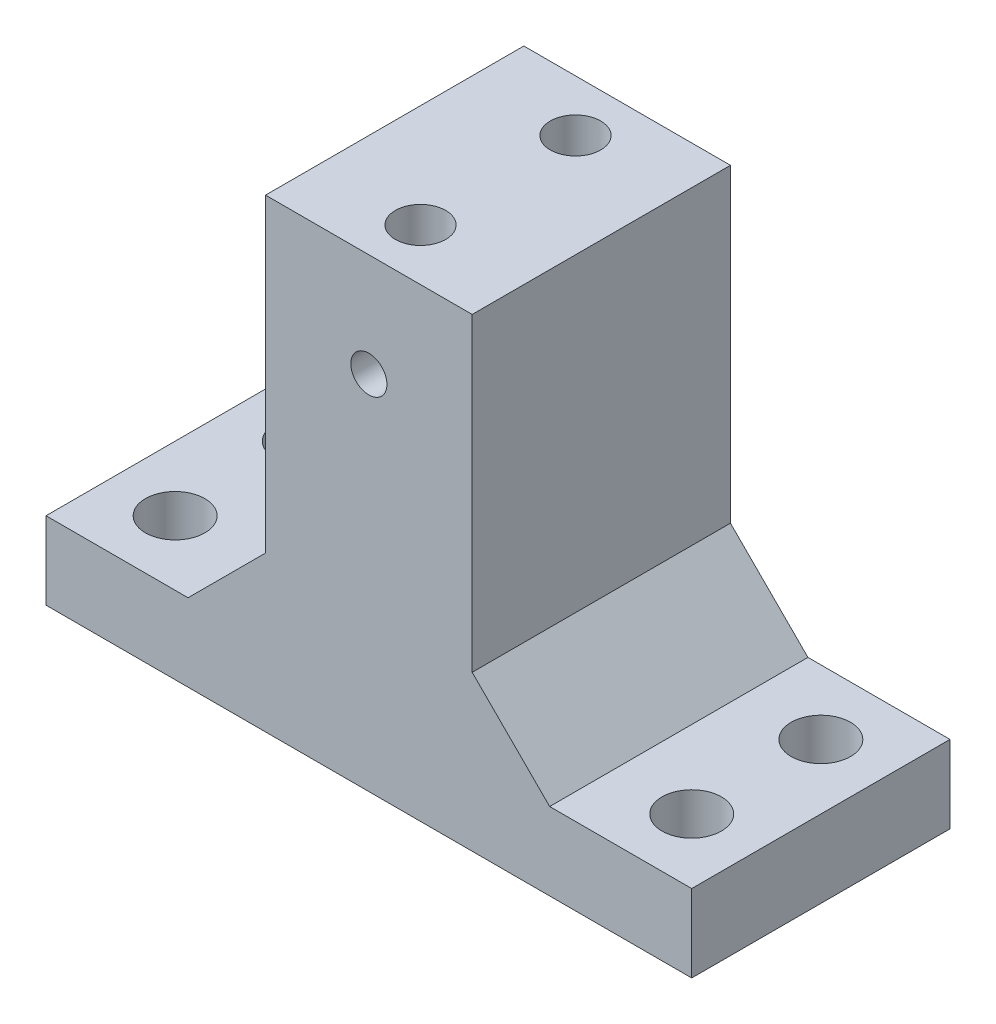
ISO-10303-21;
HEADER;
FILE_DESCRIPTION(('STEP AP214'),'2;1');
FILE_NAME('part.step','',(''),(''),'','','');
FILE_SCHEMA(('AUTOMOTIVE_DESIGN { 1 0 10303 214 1 1 1 1 }'));
ENDSEC;
DATA;
#1=APPLICATION_CONTEXT('core data for automotive mechanical design processes');
#2=APPLICATION_PROTOCOL_DEFINITION('international standard','automotive_design',2000,#1);
#3=PRODUCT_CONTEXT('',#1,'mechanical');
#4=PRODUCT('Part','Part','',(#3));
#5=PRODUCT_RELATED_PRODUCT_CATEGORY('part','',(#4));
#6=PRODUCT_DEFINITION_FORMATION('','',#4);
#7=PRODUCT_DEFINITION_CONTEXT('part definition',#1,'design');
#8=PRODUCT_DEFINITION('design','',#6,#7);
#9=PRODUCT_DEFINITION_SHAPE('','',#8);
#10=(LENGTH_UNIT() NAMED_UNIT(*) SI_UNIT(.MILLI.,.METRE.));
#11=(NAMED_UNIT(*) PLANE_ANGLE_UNIT() SI_UNIT($,.RADIAN.));
#12=(NAMED_UNIT(*) SI_UNIT($,.STERADIAN.) SOLID_ANGLE_UNIT());
#13=UNCERTAINTY_MEASURE_WITH_UNIT(LENGTH_MEASURE(1.E-05),#10,'distance_accuracy_value','');
#14=(GEOMETRIC_REPRESENTATION_CONTEXT(3) GLOBAL_UNCERTAINTY_ASSIGNED_CONTEXT((#13)) GLOBAL_UNIT_ASSIGNED_CONTEXT((#10,
#11,#12)) REPRESENTATION_CONTEXT('',''));
#15=CARTESIAN_POINT('',(0.,0.,0.));
#16=DIRECTION('',(0.,0.,1.));
#17=DIRECTION('',(1.,0.,0.));
#18=AXIS2_PLACEMENT_3D('',#15,#16,#17);
#19=CARTESIAN_POINT('',(0.,14.,24.6977156035922));
#20=DIRECTION('',(0.,0.,-1.));
#21=DIRECTION('',(-1.,0.,0.));
#22=AXIS2_PLACEMENT_3D('',#19,#20,#21);
#23=CYLINDRICAL_SURFACE('',#22,0.7);
#24=DIRECTION('',(0.,0.,-1.));
#25=VECTOR('',#24,1.);
#26=CARTESIAN_POINT('',(0.489897948556636,14.5,24.6977156035922));
#27=LINE('',#26,#25);
#28=CARTESIAN_POINT('',(0.489897948556636,14.5,-3.84298576500437));
#29=VERTEX_POINT('',#28);
#30=CARTESIAN_POINT('',(0.489897948556636,14.5,-2.15701423499563));
#31=VERTEX_POINT('',#30);
#32=EDGE_CURVE('E200',#29,#31,#27,.F.);
#33=ORIENTED_EDGE('',*,*,#32,.F.);
#34=CARTESIAN_POINT('',(0.489897948556636,14.5,-3.84298576500437));
#35=CARTESIAN_POINT('',(0.463702076997501,14.5256665395073,-3.858240649933));
#36=CARTESIAN_POINT('',(0.435290038081003,14.549464935486,-3.8730859267297));
#37=CARTESIAN_POINT('',(0.374178364808877,14.5927964363714,-3.90096614621531));
#38=CARTESIAN_POINT('',(0.341443311325071,14.6122903015919,-3.91398406929579));
#39=CARTESIAN_POINT('',(0.272112828018483,14.646101079703,-3.9369748487268));
#40=CARTESIAN_POINT('',(0.23549704326174,14.6603887553898,-3.94693046035596));
#41=CARTESIAN_POINT('',(0.159670674235997,14.6826832975427,-3.96260942016551));
#42=CARTESIAN_POINT('',(0.120471731122486,14.6907164973713,-3.96835050695298));
#43=CARTESIAN_POINT('',(0.0461411611184147,14.6993437826149,-3.97452547752463));
#44=CARTESIAN_POINT('',(0.0111559318557785,14.7007800984882,-3.97556004896241));
#45=CARTESIAN_POINT('',(-0.0585647008194994,14.6984169597849,-3.97386356010574));
#46=CARTESIAN_POINT('',(-0.0932999847412632,14.6946151491049,-3.97113080527188));
#47=CARTESIAN_POINT('',(-0.158690797614228,14.6825223218298,-3.96252050604581));
#48=CARTESIAN_POINT('',(-0.189452771763288,14.6746062732713,-3.95690606161866));
#49=CARTESIAN_POINT('',(-0.249116320443481,14.654926408477,-3.94313529367803));
#50=CARTESIAN_POINT('',(-0.278017141220935,14.6431610448802,-3.93497794802271));
#51=CARTESIAN_POINT('',(-0.335997754024226,14.6150097153164,-3.91583075311833));
#52=CARTESIAN_POINT('',(-0.364856960496907,14.5983019078948,-3.90465135219531));
#53=CARTESIAN_POINT('',(-0.41943960314165,14.5613872314768,-3.88067184026994));
#54=CARTESIAN_POINT('',(-0.445165986223585,14.5411836947613,-3.86787327581993));
#55=CARTESIAN_POINT('',(-0.476264238503783,14.513090607256,-3.85080097529133));
#56=CARTESIAN_POINT('',(-0.483153185877952,14.5066082434037,-3.84690605026586));
#57=CARTESIAN_POINT('',(-0.489897948556636,14.5,-3.84298576500437));
#58=B_SPLINE_CURVE_WITH_KNOTS('',3,(#34,#35,#36,#37,#38,#39,#40,#41,#42,#43,#44,#45,#46,#47,#48,
#49,#50,#51,#52,#53,#54,#55,#56,#57),.UNSPECIFIED.,.F.,.F.,(4,2,2,2,2,2,2,2,2,2,2,4),(0.,
0.119207686035142,0.239460891696389,0.360379376718889,0.480785960639112,0.585293490694952,
0.689848043468884,0.786212793096101,0.882616327449537,0.987745860455833,1.09277572604096,
1.12345615827102),.UNSPECIFIED.);
#59=CARTESIAN_POINT('',(-0.489897948556636,14.5,-3.84298576500437));
#60=VERTEX_POINT('',#59);
#61=EDGE_CURVE('E188',#29,#60,#58,.T.);
#62=ORIENTED_EDGE('',*,*,#61,.T.);
#63=DIRECTION('',(0.,0.,-1.));
#64=VECTOR('',#63,1.);
#65=CARTESIAN_POINT('',(-0.489897948556636,14.5,24.6977156035922));
#66=LINE('',#65,#64);
#67=CARTESIAN_POINT('',(-0.489897948556636,14.5,-2.15701423499563));
#68=VERTEX_POINT('',#67);
#69=EDGE_CURVE('E314',#68,#60,#66,.T.);
#70=ORIENTED_EDGE('',*,*,#69,.F.);
#71=CARTESIAN_POINT('',(-0.489897948556636,14.5,-2.15701423499563));
#72=CARTESIAN_POINT('',(-0.4637020769975,14.5256665395073,-2.141759350067));
#73=CARTESIAN_POINT('',(-0.435290038081002,14.549464935486,-2.1269140732703));
#74=CARTESIAN_POINT('',(-0.374178364808876,14.5927964363714,-2.09903385378469));
#75=CARTESIAN_POINT('',(-0.341443311325071,14.6122903015919,-2.08601593070421));
#76=CARTESIAN_POINT('',(-0.272112828018483,14.646101079703,-2.06302515127321));
#77=CARTESIAN_POINT('',(-0.23549704326174,14.6603887553898,-2.05306953964404));
#78=CARTESIAN_POINT('',(-0.159670674235997,14.6826832975427,-2.0373905798345));
#79=CARTESIAN_POINT('',(-0.120471731122486,14.6907164973713,-2.03164949304703));
#80=CARTESIAN_POINT('',(-0.0461411611184145,14.6993437826149,-2.02547452247537));
#81=CARTESIAN_POINT('',(-0.0111559318557783,14.7007800984882,-2.02443995103759));
#82=CARTESIAN_POINT('',(0.0585647008194996,14.6984169597849,-2.02613643989426));
#83=CARTESIAN_POINT('',(0.0932999847412634,14.6946151491049,-2.02886919472812));
#84=CARTESIAN_POINT('',(0.158690797614228,14.6825223218298,-2.03747949395419));
#85=CARTESIAN_POINT('',(0.189452771763288,14.6746062732713,-2.04309393838135));
#86=CARTESIAN_POINT('',(0.249116320443481,14.654926408477,-2.05686470632198));
#87=CARTESIAN_POINT('',(0.278017141220935,14.6431610448802,-2.0650220519773));
#88=CARTESIAN_POINT('',(0.335997754024226,14.6150097153164,-2.08416924688168));
#89=CARTESIAN_POINT('',(0.364856960496907,14.5983019078948,-2.09534864780469));
#90=CARTESIAN_POINT('',(0.41943960314165,14.5613872314768,-2.11932815973006));
#91=CARTESIAN_POINT('',(0.445165986223585,14.5411836947613,-2.13212672418007));
#92=CARTESIAN_POINT('',(0.476264238503783,14.513090607256,-2.14919902470868));
#93=CARTESIAN_POINT('',(0.483153185877952,14.5066082434037,-2.15309394973414));
#94=CARTESIAN_POINT('',(0.489897948556636,14.5,-2.15701423499563));
#95=B_SPLINE_CURVE_WITH_KNOTS('',3,(#71,#72,#73,#74,#75,#76,#77,#78,#79,#80,#81,#82,#83,#84,#85,
#86,#87,#88,#89,#90,#91,#92,#93,#94),.UNSPECIFIED.,.F.,.F.,(4,2,2,2,2,2,2,2,2,2,2,4),(0.,
0.119207686035144,0.239460891696389,0.360379376718888,0.480785960639112,0.585293490694952,
0.689848043468883,0.786212793096101,0.882616327449536,0.987745860455832,1.09277572604096,
1.12345615827102),.UNSPECIFIED.);
#96=EDGE_CURVE('E194',#68,#31,#95,.T.);
#97=ORIENTED_EDGE('',*,*,#96,.T.);
#98=EDGE_LOOP('',(#33,#62,#70,#97));
#99=FACE_BOUND('',#98,.T.);
#100=CARTESIAN_POINT('',(0.,14.,5.));
#101=DIRECTION('',(0.,0.,-1.));
#102=DIRECTION('',(-1.,0.,0.));
#103=AXIS2_PLACEMENT_3D('',#100,#101,#102);
#104=CIRCLE('',#103,0.7);
#105=CARTESIAN_POINT('',(-0.7,14.,5.));
#106=VERTEX_POINT('',#105);
#107=EDGE_CURVE('E261',#106,#106,#104,.F.);
#108=ORIENTED_EDGE('',*,*,#107,.T.);
#109=EDGE_LOOP('',(#108));
#110=FACE_BOUND('',#109,.T.);
#111=CARTESIAN_POINT('',(0.,14.,-5.));
#112=DIRECTION('',(0.,0.,-1.));
#113=DIRECTION('',(-1.,0.,0.));
#114=AXIS2_PLACEMENT_3D('',#111,#112,#113);
#115=CIRCLE('',#114,0.7);
#116=CARTESIAN_POINT('',(-0.7,14.,-5.));
#117=VERTEX_POINT('',#116);
#118=EDGE_CURVE('E254',#117,#117,#115,.T.);
#119=ORIENTED_EDGE('',*,*,#118,.T.);
#120=EDGE_LOOP('',(#119));
#121=FACE_BOUND('',#120,.T.);
#122=DIRECTION('',(0.,0.,-1.));
#123=VECTOR('',#122,1.);
#124=CARTESIAN_POINT('',(0.489897948556636,14.5,24.6977156035922));
#125=LINE('',#124,#123);
#126=CARTESIAN_POINT('',(0.489897948556636,14.5,2.15701423499563));
#127=VERTEX_POINT('',#126);
#128=CARTESIAN_POINT('',(0.489897948556636,14.5,3.84298576500437));
#129=VERTEX_POINT('',#128);
#130=EDGE_CURVE('E133',#127,#129,#125,.F.);
#131=ORIENTED_EDGE('',*,*,#130,.F.);
#132=CARTESIAN_POINT('',(0.489897948556636,14.5,2.15701423499563));
#133=CARTESIAN_POINT('',(0.463702076997501,14.5256665395073,2.141759350067));
#134=CARTESIAN_POINT('',(0.435290038081003,14.549464935486,2.12691407327031));
#135=CARTESIAN_POINT('',(0.374178364808877,14.5927964363714,2.09903385378469));
#136=CARTESIAN_POINT('',(0.341443311325071,14.6122903015919,2.08601593070421));
#137=CARTESIAN_POINT('',(0.272112828018484,14.646101079703,2.06302515127321));
#138=CARTESIAN_POINT('',(0.23549704326174,14.6603887553898,2.05306953964404));
#139=CARTESIAN_POINT('',(0.159670674235998,14.6826832975427,2.0373905798345));
#140=CARTESIAN_POINT('',(0.120471731122486,14.6907164973713,2.03164949304703));
#141=CARTESIAN_POINT('',(0.0461411611184149,14.6993437826149,2.02547452247537));
#142=CARTESIAN_POINT('',(0.0111559318557788,14.7007800984882,2.02443995103759));
#143=CARTESIAN_POINT('',(-0.0585647008194992,14.6984169597849,2.02613643989426));
#144=CARTESIAN_POINT('',(-0.0932999847412631,14.6946151491049,2.02886919472812));
#145=CARTESIAN_POINT('',(-0.158690797614228,14.6825223218298,2.03747949395419));
#146=CARTESIAN_POINT('',(-0.189452771763287,14.6746062732713,2.04309393838135));
#147=CARTESIAN_POINT('',(-0.24911632044348,14.654926408477,2.05686470632198));
#148=CARTESIAN_POINT('',(-0.278017141220935,14.6431610448802,2.0650220519773));
#149=CARTESIAN_POINT('',(-0.335997754024226,14.6150097153164,2.08416924688168));
#150=CARTESIAN_POINT('',(-0.364856960496907,14.5983019078948,2.09534864780469));
#151=CARTESIAN_POINT('',(-0.419439603141649,14.5613872314768,2.11932815973006));
#152=CARTESIAN_POINT('',(-0.445165986223585,14.5411836947613,2.13212672418007));
#153=CARTESIAN_POINT('',(-0.476264238503782,14.513090607256,2.14919902470868));
#154=CARTESIAN_POINT('',(-0.483153185877952,14.5066082434037,2.15309394973414));
#155=CARTESIAN_POINT('',(-0.489897948556636,14.5,2.15701423499563));
#156=B_SPLINE_CURVE_WITH_KNOTS('',3,(#132,#133,#134,#135,#136,#137,#138,#139,#140,#141,#142,
#143,#144,#145,#146,#147,#148,#149,#150,#151,#152,#153,#154,#155),.UNSPECIFIED.,.F.,.F.,(4,2,2,
2,2,2,2,2,2,2,2,4),(0.,0.119207686035142,0.239460891696389,0.360379376718889,0.480785960639112,
0.585293490694952,0.689848043468883,0.786212793096101,0.882616327449536,0.987745860455832,
1.09277572604096,1.12345615827102),.UNSPECIFIED.);
#157=CARTESIAN_POINT('',(-0.489897948556636,14.5,2.15701423499563));
#158=VERTEX_POINT('',#157);
#159=EDGE_CURVE('E149',#127,#158,#156,.T.);
#160=ORIENTED_EDGE('',*,*,#159,.T.);
#161=DIRECTION('',(0.,0.,-1.));
#162=VECTOR('',#161,1.);
#163=CARTESIAN_POINT('',(-0.489897948556636,14.5,24.6977156035922));
#164=LINE('',#163,#162);
#165=CARTESIAN_POINT('',(-0.489897948556636,14.5,3.84298576500437));
#166=VERTEX_POINT('',#165);
#167=EDGE_CURVE('E141',#166,#158,#164,.T.);
#168=ORIENTED_EDGE('',*,*,#167,.F.);
#169=CARTESIAN_POINT('',(-0.489897948556636,14.5,3.84298576500437));
#170=CARTESIAN_POINT('',(-0.4637020769975,14.5256665395073,3.858240649933));
#171=CARTESIAN_POINT('',(-0.435290038081003,14.549464935486,3.8730859267297));
#172=CARTESIAN_POINT('',(-0.374178364808876,14.5927964363714,3.90096614621531));
#173=CARTESIAN_POINT('',(-0.341443311325071,14.6122903015919,3.9139840692958));
#174=CARTESIAN_POINT('',(-0.272112828018483,14.646101079703,3.9369748487268));
#175=CARTESIAN_POINT('',(-0.235497043261739,14.6603887553898,3.94693046035596));
#176=CARTESIAN_POINT('',(-0.159670674235997,14.6826832975427,3.96260942016551));
#177=CARTESIAN_POINT('',(-0.120471731122485,14.6907164973713,3.96835050695298));
#178=CARTESIAN_POINT('',(-0.0461411611184145,14.6993437826149,3.97452547752463));
#179=CARTESIAN_POINT('',(-0.0111559318557784,14.7007800984882,3.97556004896241));
#180=CARTESIAN_POINT('',(0.0585647008194995,14.6984169597849,3.97386356010574));
#181=CARTESIAN_POINT('',(0.0932999847412634,14.6946151491049,3.97113080527188));
#182=CARTESIAN_POINT('',(0.158690797614229,14.6825223218298,3.96252050604581));
#183=CARTESIAN_POINT('',(0.189452771763288,14.6746062732713,3.95690606161866));
#184=CARTESIAN_POINT('',(0.249116320443481,14.654926408477,3.94313529367803));
#185=CARTESIAN_POINT('',(0.278017141220935,14.6431610448802,3.93497794802271));
#186=CARTESIAN_POINT('',(0.335997754024226,14.6150097153164,3.91583075311833));
#187=CARTESIAN_POINT('',(0.364856960496907,14.5983019078948,3.90465135219531));
#188=CARTESIAN_POINT('',(0.41943960314165,14.5613872314768,3.88067184026994));
#189=CARTESIAN_POINT('',(0.445165986223585,14.5411836947613,3.86787327581993));
#190=CARTESIAN_POINT('',(0.476264238503783,14.513090607256,3.85080097529133));
#191=CARTESIAN_POINT('',(0.483153185877952,14.5066082434037,3.84690605026586));
#192=CARTESIAN_POINT('',(0.489897948556636,14.5,3.84298576500437));
#193=B_SPLINE_CURVE_WITH_KNOTS('',3,(#169,#170,#171,#172,#173,#174,#175,#176,#177,#178,#179,
#180,#181,#182,#183,#184,#185,#186,#187,#188,#189,#190,#191,#192),.UNSPECIFIED.,.F.,.F.,(4,2,2,
2,2,2,2,2,2,2,2,4),(0.,0.119207686035144,0.23946089169639,0.360379376718889,0.480785960639112,
0.585293490694952,0.689848043468884,0.786212793096102,0.882616327449536,0.987745860455832,
1.09277572604096,1.12345615827102),.UNSPECIFIED.);
#194=EDGE_CURVE('E147',#166,#129,#193,.T.);
#195=ORIENTED_EDGE('',*,*,#194,.T.);
#196=EDGE_LOOP('',(#131,#160,#168,#195));
#197=FACE_BOUND('',#196,.T.);
#198=ADVANCED_FACE('F33',(#99,#110,#121,#197),#23,.F.);
#199=CARTESIAN_POINT('',(0.,3.,0.));
#200=DIRECTION('',(0.,-1.,0.));
#201=DIRECTION('',(0.,0.,-1.));
#202=AXIS2_PLACEMENT_3D('',#199,#200,#201);
#203=PLANE('',#202);
#204=CARTESIAN_POINT('',(-10.,3.,2.5));
#205=DIRECTION('',(0.,1.,0.));
#206=DIRECTION('',(0.,0.,1.));
#207=AXIS2_PLACEMENT_3D('',#204,#205,#206);
#208=CIRCLE('',#207,1.15);
#209=CARTESIAN_POINT('',(-10.,3.,3.65));
#210=VERTEX_POINT('',#209);
#211=EDGE_CURVE('E278',#210,#210,#208,.T.);
#212=ORIENTED_EDGE('',*,*,#211,.F.);
#213=EDGE_LOOP('',(#212));
#214=FACE_BOUND('',#213,.T.);
#215=CARTESIAN_POINT('',(-10.,3.,-2.5));
#216=DIRECTION('',(0.,1.,0.));
#217=DIRECTION('',(0.,0.,1.));
#218=AXIS2_PLACEMENT_3D('',#215,#216,#217);
#219=CIRCLE('',#218,1.15);
#220=CARTESIAN_POINT('',(-10.,3.,-1.35));
#221=VERTEX_POINT('',#220);
#222=EDGE_CURVE('E284',#221,#221,#219,.T.);
#223=ORIENTED_EDGE('',*,*,#222,.F.);
#224=EDGE_LOOP('',(#223));
#225=FACE_BOUND('',#224,.T.);
#226=DIRECTION('',(1.,0.,0.));
#227=VECTOR('',#226,1.);
#228=CARTESIAN_POINT('',(-12.5,3.,5.));
#229=LINE('',#228,#227);
#230=CARTESIAN_POINT('',(-12.5,3.,5.));
#231=VERTEX_POINT('',#230);
#232=CARTESIAN_POINT('',(-7.00000000000002,3.,5.));
#233=VERTEX_POINT('',#232);
#234=EDGE_CURVE('E221',#231,#233,#229,.T.);
#235=ORIENTED_EDGE('',*,*,#234,.T.);
#236=DIRECTION('',(0.,0.,-1.));
#237=VECTOR('',#236,1.);
#238=CARTESIAN_POINT('',(-7.00000000000002,3.,0.));
#239=LINE('',#238,#237);
#240=CARTESIAN_POINT('',(-7.00000000000002,3.,-5.));
#241=VERTEX_POINT('',#240);
#242=EDGE_CURVE('E140',#233,#241,#239,.T.);
#243=ORIENTED_EDGE('',*,*,#242,.T.);
#244=DIRECTION('',(-1.,0.,0.));
#245=VECTOR('',#244,1.);
#246=CARTESIAN_POINT('',(-12.5,3.,-5.));
#247=LINE('',#246,#245);
#248=CARTESIAN_POINT('',(-12.5,3.,-5.));
#249=VERTEX_POINT('',#248);
#250=EDGE_CURVE('E244',#241,#249,#247,.T.);
#251=ORIENTED_EDGE('',*,*,#250,.T.);
#252=DIRECTION('',(0.,0.,1.));
#253=VECTOR('',#252,1.);
#254=CARTESIAN_POINT('',(-12.5,3.,5.));
#255=LINE('',#254,#253);
#256=EDGE_CURVE('E231',#249,#231,#255,.T.);
#257=ORIENTED_EDGE('',*,*,#256,.T.);
#258=EDGE_LOOP('',(#235,#243,#251,#257));
#259=FACE_BOUND('',#258,.T.);
#260=ADVANCED_FACE('F228',(#214,#225,#259),#203,.F.);
#261=CARTESIAN_POINT('',(12.5,3.,-5.));
#262=VERTEX_POINT('',#261);
#263=CARTESIAN_POINT('',(7.00000000000002,3.,-5.));
#264=VERTEX_POINT('',#263);
#265=EDGE_CURVE('E294',#262,#264,#247,.T.);
#266=ORIENTED_EDGE('',*,*,#265,.T.);
#267=DIRECTION('',(0.,0.,1.));
#268=VECTOR('',#267,1.);
#269=CARTESIAN_POINT('',(7.00000000000002,3.,0.));
#270=LINE('',#269,#268);
#271=CARTESIAN_POINT('',(7.00000000000002,3.,5.));
#272=VERTEX_POINT('',#271);
#273=EDGE_CURVE('E207',#264,#272,#270,.T.);
#274=ORIENTED_EDGE('',*,*,#273,.T.);
#275=CARTESIAN_POINT('',(12.5,3.,5.));
#276=VERTEX_POINT('',#275);
#277=EDGE_CURVE('E234',#272,#276,#229,.T.);
#278=ORIENTED_EDGE('',*,*,#277,.T.);
#279=DIRECTION('',(0.,0.,-1.));
#280=VECTOR('',#279,1.);
#281=CARTESIAN_POINT('',(12.5,3.,5.));
#282=LINE('',#281,#280);
#283=EDGE_CURVE('E290',#276,#262,#282,.T.);
#284=ORIENTED_EDGE('',*,*,#283,.T.);
#285=EDGE_LOOP('',(#266,#274,#278,#284));
#286=FACE_BOUND('',#285,.T.);
#287=CARTESIAN_POINT('',(10.,3.,-2.5));
#288=DIRECTION('',(0.,1.,0.));
#289=DIRECTION('',(0.,0.,1.));
#290=AXIS2_PLACEMENT_3D('',#287,#288,#289);
#291=CIRCLE('',#290,1.15);
#292=CARTESIAN_POINT('',(10.,3.,-1.35));
#293=VERTEX_POINT('',#292);
#294=EDGE_CURVE('E272',#293,#293,#291,.T.);
#295=ORIENTED_EDGE('',*,*,#294,.F.);
#296=EDGE_LOOP('',(#295));
#297=FACE_BOUND('',#296,.T.);
#298=CARTESIAN_POINT('',(10.,3.,2.5));
#299=DIRECTION('',(0.,1.,0.));
#300=DIRECTION('',(0.,0.,1.));
#301=AXIS2_PLACEMENT_3D('',#298,#299,#300);
#302=CIRCLE('',#301,1.15);
#303=CARTESIAN_POINT('',(10.,3.,3.65));
#304=VERTEX_POINT('',#303);
#305=EDGE_CURVE('E266',#304,#304,#302,.T.);
#306=ORIENTED_EDGE('',*,*,#305,.F.);
#307=EDGE_LOOP('',(#306));
#308=FACE_BOUND('',#307,.T.);
#309=ADVANCED_FACE('F343',(#286,#297,#308),#203,.F.);
#310=CARTESIAN_POINT('',(0.,0.,0.));
#311=DIRECTION('',(0.,-1.,0.));
#312=DIRECTION('',(0.,0.,-1.));
#313=AXIS2_PLACEMENT_3D('',#310,#311,#312);
#314=PLANE('',#313);
#315=DIRECTION('',(0.,0.,-1.));
#316=VECTOR('',#315,1.);
#317=CARTESIAN_POINT('',(12.5,0.,5.));
#318=LINE('',#317,#316);
#319=CARTESIAN_POINT('',(12.5,0.,5.));
#320=VERTEX_POINT('',#319);
#321=CARTESIAN_POINT('',(12.5,0.,-5.));
#322=VERTEX_POINT('',#321);
#323=EDGE_CURVE('E287',#320,#322,#318,.T.);
#324=ORIENTED_EDGE('',*,*,#323,.F.);
#325=DIRECTION('',(1.,0.,0.));
#326=VECTOR('',#325,1.);
#327=CARTESIAN_POINT('',(-12.5,0.,5.));
#328=LINE('',#327,#326);
#329=CARTESIAN_POINT('',(-12.5,0.,5.));
#330=VERTEX_POINT('',#329);
#331=EDGE_CURVE('E293',#330,#320,#328,.T.);
#332=ORIENTED_EDGE('',*,*,#331,.F.);
#333=DIRECTION('',(0.,0.,1.));
#334=VECTOR('',#333,1.);
#335=CARTESIAN_POINT('',(-12.5,0.,5.));
#336=LINE('',#335,#334);
#337=CARTESIAN_POINT('',(-12.5,0.,-5.));
#338=VERTEX_POINT('',#337);
#339=EDGE_CURVE('E302',#338,#330,#336,.T.);
#340=ORIENTED_EDGE('',*,*,#339,.F.);
#341=DIRECTION('',(-1.,0.,0.));
#342=VECTOR('',#341,1.);
#343=CARTESIAN_POINT('',(-12.5,0.,-5.));
#344=LINE('',#343,#342);
#345=EDGE_CURVE('E300',#322,#338,#344,.T.);
#346=ORIENTED_EDGE('',*,*,#345,.F.);
#347=EDGE_LOOP('',(#324,#332,#340,#346));
#348=FACE_BOUND('',#347,.T.);
#349=CARTESIAN_POINT('',(10.,0.,-2.5));
#350=DIRECTION('',(0.,1.,0.));
#351=DIRECTION('',(0.,0.,1.));
#352=AXIS2_PLACEMENT_3D('',#349,#350,#351);
#353=CIRCLE('',#352,1.15);
#354=CARTESIAN_POINT('',(10.,0.,-1.35));
#355=VERTEX_POINT('',#354);
#356=EDGE_CURVE('E269',#355,#355,#353,.T.);
#357=ORIENTED_EDGE('',*,*,#356,.T.);
#358=EDGE_LOOP('',(#357));
#359=FACE_BOUND('',#358,.T.);
#360=CARTESIAN_POINT('',(10.,0.,2.5));
#361=DIRECTION('',(0.,1.,0.));
#362=DIRECTION('',(0.,0.,1.));
#363=AXIS2_PLACEMENT_3D('',#360,#361,#362);
#364=CIRCLE('',#363,1.15);
#365=CARTESIAN_POINT('',(10.,0.,3.65));
#366=VERTEX_POINT('',#365);
#367=EDGE_CURVE('E264',#366,#366,#364,.T.);
#368=ORIENTED_EDGE('',*,*,#367,.T.);
#369=EDGE_LOOP('',(#368));
#370=FACE_BOUND('',#369,.T.);
#371=CARTESIAN_POINT('',(-10.,0.,2.5));
#372=DIRECTION('',(0.,1.,0.));
#373=DIRECTION('',(0.,0.,1.));
#374=AXIS2_PLACEMENT_3D('',#371,#372,#373);
#375=CIRCLE('',#374,1.15);
#376=CARTESIAN_POINT('',(-10.,0.,3.65));
#377=VERTEX_POINT('',#376);
#378=EDGE_CURVE('E275',#377,#377,#375,.T.);
#379=ORIENTED_EDGE('',*,*,#378,.T.);
#380=EDGE_LOOP('',(#379));
#381=FACE_BOUND('',#380,.T.);
#382=CARTESIAN_POINT('',(-10.,0.,-2.5));
#383=DIRECTION('',(0.,1.,0.));
#384=DIRECTION('',(0.,0.,1.));
#385=AXIS2_PLACEMENT_3D('',#382,#383,#384);
#386=CIRCLE('',#385,1.15);
#387=CARTESIAN_POINT('',(-10.,0.,-1.35));
#388=VERTEX_POINT('',#387);
#389=EDGE_CURVE('E281',#388,#388,#386,.T.);
#390=ORIENTED_EDGE('',*,*,#389,.T.);
#391=EDGE_LOOP('',(#390));
#392=FACE_BOUND('',#391,.T.);
#393=ADVANCED_FACE('F356',(#348,#359,#370,#381,#392),#314,.T.);
#394=CARTESIAN_POINT('',(12.5,3.,5.));
#395=DIRECTION('',(-1.,0.,0.));
#396=DIRECTION('',(0.,0.,1.));
#397=AXIS2_PLACEMENT_3D('',#394,#395,#396);
#398=PLANE('',#397);
#399=ORIENTED_EDGE('',*,*,#323,.T.);
#400=DIRECTION('',(0.,-1.,0.));
#401=VECTOR('',#400,1.);
#402=CARTESIAN_POINT('',(12.5,3.,-5.));
#403=LINE('',#402,#401);
#404=EDGE_CURVE('E312',#262,#322,#403,.T.);
#405=ORIENTED_EDGE('',*,*,#404,.F.);
#406=ORIENTED_EDGE('',*,*,#283,.F.);
#407=DIRECTION('',(0.,-1.,0.));
#408=VECTOR('',#407,1.);
#409=CARTESIAN_POINT('',(12.5,3.,5.));
#410=LINE('',#409,#408);
#411=EDGE_CURVE('E233',#276,#320,#410,.T.);
#412=ORIENTED_EDGE('',*,*,#411,.T.);
#413=EDGE_LOOP('',(#399,#405,#406,#412));
#414=FACE_BOUND('',#413,.T.);
#415=ADVANCED_FACE('F351',(#414),#398,.F.);
#416=CARTESIAN_POINT('',(-12.5,3.,-5.));
#417=DIRECTION('',(0.,0.,1.));
#418=DIRECTION('',(1.,0.,0.));
#419=AXIS2_PLACEMENT_3D('',#416,#417,#418);
#420=PLANE('',#419);
#421=ORIENTED_EDGE('',*,*,#345,.T.);
#422=DIRECTION('',(0.,-1.,0.));
#423=VECTOR('',#422,1.);
#424=CARTESIAN_POINT('',(-12.5,3.,-5.));
#425=LINE('',#424,#423);
#426=EDGE_CURVE('E309',#249,#338,#425,.T.);
#427=ORIENTED_EDGE('',*,*,#426,.F.);
#428=ORIENTED_EDGE('',*,*,#250,.F.);
#429=DIRECTION('',(0.707106781186552,0.707106781186543,0.));
#430=VECTOR('',#429,1.);
#431=CARTESIAN_POINT('',(-9.75000000000004,0.250000000000009,-5.));
#432=LINE('',#431,#430);
#433=CARTESIAN_POINT('',(-4.,5.99999999999998,-5.));
#434=VERTEX_POINT('',#433);
#435=EDGE_CURVE('E211',#241,#434,#432,.T.);
#436=ORIENTED_EDGE('',*,*,#435,.T.);
#437=DIRECTION('',(0.,1.,0.));
#438=VECTOR('',#437,1.);
#439=CARTESIAN_POINT('',(-4.,0.,-5.));
#440=LINE('',#439,#438);
#441=CARTESIAN_POINT('',(-4.,18.,-5.));
#442=VERTEX_POINT('',#441);
#443=EDGE_CURVE('E241',#434,#442,#440,.T.);
#444=ORIENTED_EDGE('',*,*,#443,.T.);
#445=DIRECTION('',(1.,0.,0.));
#446=VECTOR('',#445,1.);
#447=CARTESIAN_POINT('',(4.,18.,-5.));
#448=LINE('',#447,#446);
#449=CARTESIAN_POINT('',(4.,18.,-5.));
#450=VERTEX_POINT('',#449);
#451=EDGE_CURVE('E250',#442,#450,#448,.T.);
#452=ORIENTED_EDGE('',*,*,#451,.T.);
#453=DIRECTION('',(0.,-1.,0.));
#454=VECTOR('',#453,1.);
#455=CARTESIAN_POINT('',(4.,0.,-5.));
#456=LINE('',#455,#454);
#457=CARTESIAN_POINT('',(4.,5.99999999999999,-5.));
#458=VERTEX_POINT('',#457);
#459=EDGE_CURVE('E251',#450,#458,#456,.T.);
#460=ORIENTED_EDGE('',*,*,#459,.T.);
#461=DIRECTION('',(0.707106781186552,-0.707106781186544,0.));
#462=VECTOR('',#461,1.);
#463=CARTESIAN_POINT('',(-2.7500000000001,12.75,-5.));
#464=LINE('',#463,#462);
#465=EDGE_CURVE('E11',#458,#264,#464,.T.);
#466=ORIENTED_EDGE('',*,*,#465,.T.);
#467=ORIENTED_EDGE('',*,*,#265,.F.);
#468=ORIENTED_EDGE('',*,*,#404,.T.);
#469=EDGE_LOOP('',(#421,#427,#428,#436,#444,#452,#460,#466,#467,#468));
#470=FACE_BOUND('',#469,.T.);
#471=ORIENTED_EDGE('',*,*,#118,.F.);
#472=EDGE_LOOP('',(#471));
#473=FACE_BOUND('',#472,.T.);
#474=ADVANCED_FACE('F238',(#470,#473),#420,.F.);
#475=CARTESIAN_POINT('',(-12.5,3.,5.));
#476=DIRECTION('',(1.,0.,0.));
#477=DIRECTION('',(0.,0.,-1.));
#478=AXIS2_PLACEMENT_3D('',#475,#476,#477);
#479=PLANE('',#478);
#480=ORIENTED_EDGE('',*,*,#339,.T.);
#481=DIRECTION('',(0.,-1.,0.));
#482=VECTOR('',#481,1.);
#483=CARTESIAN_POINT('',(-12.5,3.,5.));
#484=LINE('',#483,#482);
#485=EDGE_CURVE('E307',#231,#330,#484,.T.);
#486=ORIENTED_EDGE('',*,*,#485,.F.);
#487=ORIENTED_EDGE('',*,*,#256,.F.);
#488=ORIENTED_EDGE('',*,*,#426,.T.);
#489=EDGE_LOOP('',(#480,#486,#487,#488));
#490=FACE_BOUND('',#489,.T.);
#491=ADVANCED_FACE('F355',(#490),#479,.F.);
#492=CARTESIAN_POINT('',(-12.5,3.,5.));
#493=DIRECTION('',(0.,0.,-1.));
#494=DIRECTION('',(-1.,0.,0.));
#495=AXIS2_PLACEMENT_3D('',#492,#493,#494);
#496=PLANE('',#495);
#497=ORIENTED_EDGE('',*,*,#277,.F.);
#498=DIRECTION('',(-0.707106781186552,0.707106781186544,0.));
#499=VECTOR('',#498,1.);
#500=CARTESIAN_POINT('',(-2.7500000000001,12.75,5.));
#501=LINE('',#500,#499);
#502=CARTESIAN_POINT('',(4.,5.99999999999999,5.));
#503=VERTEX_POINT('',#502);
#504=EDGE_CURVE('E41',#272,#503,#501,.T.);
#505=ORIENTED_EDGE('',*,*,#504,.T.);
#506=DIRECTION('',(0.,1.,0.));
#507=VECTOR('',#506,1.);
#508=CARTESIAN_POINT('',(4.,0.,5.));
#509=LINE('',#508,#507);
#510=CARTESIAN_POINT('',(4.,18.,5.));
#511=VERTEX_POINT('',#510);
#512=EDGE_CURVE('E265',#503,#511,#509,.T.);
#513=ORIENTED_EDGE('',*,*,#512,.T.);
#514=DIRECTION('',(-1.,0.,0.));
#515=VECTOR('',#514,1.);
#516=CARTESIAN_POINT('',(4.,18.,5.));
#517=LINE('',#516,#515);
#518=CARTESIAN_POINT('',(-4.,18.,5.));
#519=VERTEX_POINT('',#518);
#520=EDGE_CURVE('E333',#511,#519,#517,.T.);
#521=ORIENTED_EDGE('',*,*,#520,.T.);
#522=DIRECTION('',(0.,-1.,0.));
#523=VECTOR('',#522,1.);
#524=CARTESIAN_POINT('',(-4.,0.,5.));
#525=LINE('',#524,#523);
#526=CARTESIAN_POINT('',(-4.,5.99999999999998,5.));
#527=VERTEX_POINT('',#526);
#528=EDGE_CURVE('E223',#519,#527,#525,.T.);
#529=ORIENTED_EDGE('',*,*,#528,.T.);
#530=DIRECTION('',(-0.707106781186552,-0.707106781186543,0.));
#531=VECTOR('',#530,1.);
#532=CARTESIAN_POINT('',(-9.75000000000004,0.250000000000009,5.));
#533=LINE('',#532,#531);
#534=EDGE_CURVE('E213',#527,#233,#533,.T.);
#535=ORIENTED_EDGE('',*,*,#534,.T.);
#536=ORIENTED_EDGE('',*,*,#234,.F.);
#537=ORIENTED_EDGE('',*,*,#485,.T.);
#538=ORIENTED_EDGE('',*,*,#331,.T.);
#539=ORIENTED_EDGE('',*,*,#411,.F.);
#540=EDGE_LOOP('',(#497,#505,#513,#521,#529,#535,#536,#537,#538,#539));
#541=FACE_BOUND('',#540,.T.);
#542=ORIENTED_EDGE('',*,*,#107,.F.);
#543=EDGE_LOOP('',(#542));
#544=FACE_BOUND('',#543,.T.);
#545=ADVANCED_FACE('F218',(#541,#544),#496,.F.);
#546=CARTESIAN_POINT('',(-10.,3.,-2.5));
#547=DIRECTION('',(0.,-1.,0.));
#548=DIRECTION('',(0.,0.,-1.));
#549=AXIS2_PLACEMENT_3D('',#546,#547,#548);
#550=CYLINDRICAL_SURFACE('',#549,1.15);
#551=ORIENTED_EDGE('',*,*,#222,.T.);
#552=EDGE_LOOP('',(#551));
#553=FACE_BOUND('',#552,.T.);
#554=ORIENTED_EDGE('',*,*,#389,.F.);
#555=EDGE_LOOP('',(#554));
#556=FACE_BOUND('',#555,.T.);
#557=ADVANCED_FACE('F368',(#553,#556),#550,.F.);
#558=CARTESIAN_POINT('',(-10.,3.,2.5));
#559=DIRECTION('',(0.,-1.,0.));
#560=DIRECTION('',(0.,0.,-1.));
#561=AXIS2_PLACEMENT_3D('',#558,#559,#560);
#562=CYLINDRICAL_SURFACE('',#561,1.15);
#563=ORIENTED_EDGE('',*,*,#211,.T.);
#564=EDGE_LOOP('',(#563));
#565=FACE_BOUND('',#564,.T.);
#566=ORIENTED_EDGE('',*,*,#378,.F.);
#567=EDGE_LOOP('',(#566));
#568=FACE_BOUND('',#567,.T.);
#569=ADVANCED_FACE('F370',(#565,#568),#562,.F.);
#570=CARTESIAN_POINT('',(10.,3.,-2.5));
#571=DIRECTION('',(0.,-1.,0.));
#572=DIRECTION('',(0.,0.,-1.));
#573=AXIS2_PLACEMENT_3D('',#570,#571,#572);
#574=CYLINDRICAL_SURFACE('',#573,1.15);
#575=ORIENTED_EDGE('',*,*,#294,.T.);
#576=EDGE_LOOP('',(#575));
#577=FACE_BOUND('',#576,.T.);
#578=ORIENTED_EDGE('',*,*,#356,.F.);
#579=EDGE_LOOP('',(#578));
#580=FACE_BOUND('',#579,.T.);
#581=ADVANCED_FACE('F377',(#577,#580),#574,.F.);
#582=CARTESIAN_POINT('',(10.,3.,2.5));
#583=DIRECTION('',(0.,-1.,0.));
#584=DIRECTION('',(0.,0.,-1.));
#585=AXIS2_PLACEMENT_3D('',#582,#583,#584);
#586=CYLINDRICAL_SURFACE('',#585,1.15);
#587=ORIENTED_EDGE('',*,*,#305,.T.);
#588=EDGE_LOOP('',(#587));
#589=FACE_BOUND('',#588,.T.);
#590=ORIENTED_EDGE('',*,*,#367,.F.);
#591=EDGE_LOOP('',(#590));
#592=FACE_BOUND('',#591,.T.);
#593=ADVANCED_FACE('F428',(#589,#592),#586,.F.);
#594=CARTESIAN_POINT('',(-4.,0.,24.6977156035922));
#595=DIRECTION('',(-1.,0.,0.));
#596=DIRECTION('',(0.,-1.,0.));
#597=AXIS2_PLACEMENT_3D('',#594,#595,#596);
#598=PLANE('',#597);
#599=ORIENTED_EDGE('',*,*,#443,.F.);
#600=DIRECTION('',(0.,0.,1.));
#601=VECTOR('',#600,1.);
#602=CARTESIAN_POINT('',(-4.,5.99999999999998,24.6977156035922));
#603=LINE('',#602,#601);
#604=EDGE_CURVE('E205',#434,#527,#603,.T.);
#605=ORIENTED_EDGE('',*,*,#604,.T.);
#606=ORIENTED_EDGE('',*,*,#528,.F.);
#607=DIRECTION('',(0.,0.,-1.));
#608=VECTOR('',#607,1.);
#609=CARTESIAN_POINT('',(-4.,18.,24.6977156035922));
#610=LINE('',#609,#608);
#611=EDGE_CURVE('E248',#519,#442,#610,.T.);
#612=ORIENTED_EDGE('',*,*,#611,.T.);
#613=EDGE_LOOP('',(#599,#605,#606,#612));
#614=FACE_BOUND('',#613,.T.);
#615=ADVANCED_FACE('F246',(#614),#598,.T.);
#616=CARTESIAN_POINT('',(4.,0.,24.6977156035922));
#617=DIRECTION('',(1.,0.,0.));
#618=DIRECTION('',(0.,1.,0.));
#619=AXIS2_PLACEMENT_3D('',#616,#617,#618);
#620=PLANE('',#619);
#621=ORIENTED_EDGE('',*,*,#512,.F.);
#622=DIRECTION('',(0.,0.,-1.));
#623=VECTOR('',#622,1.);
#624=CARTESIAN_POINT('',(4.,5.99999999999999,24.6977156035922));
#625=LINE('',#624,#623);
#626=EDGE_CURVE('E54',#503,#458,#625,.T.);
#627=ORIENTED_EDGE('',*,*,#626,.T.);
#628=ORIENTED_EDGE('',*,*,#459,.F.);
#629=DIRECTION('',(0.,0.,-1.));
#630=VECTOR('',#629,1.);
#631=CARTESIAN_POINT('',(4.,18.,24.6977156035922));
#632=LINE('',#631,#630);
#633=EDGE_CURVE('E258',#511,#450,#632,.T.);
#634=ORIENTED_EDGE('',*,*,#633,.F.);
#635=EDGE_LOOP('',(#621,#627,#628,#634));
#636=FACE_BOUND('',#635,.T.);
#637=ADVANCED_FACE('F338',(#636),#620,.T.);
#638=CARTESIAN_POINT('',(4.,18.,24.6977156035922));
#639=DIRECTION('',(0.,1.,0.));
#640=DIRECTION('',(0.,0.,1.));
#641=AXIS2_PLACEMENT_3D('',#638,#639,#640);
#642=PLANE('',#641);
#643=CARTESIAN_POINT('',(0.,18.,3.));
#644=DIRECTION('',(0.,1.,0.));
#645=DIRECTION('',(-1.,0.,0.));
#646=AXIS2_PLACEMENT_3D('',#643,#644,#645);
#647=CIRCLE('',#646,0.975);
#648=CARTESIAN_POINT('',(-0.974999999999998,18.,3.));
#649=VERTEX_POINT('',#648);
#650=EDGE_CURVE('E161',#649,#649,#647,.T.);
#651=ORIENTED_EDGE('',*,*,#650,.F.);
#652=EDGE_LOOP('',(#651));
#653=FACE_BOUND('',#652,.T.);
#654=CARTESIAN_POINT('',(0.,18.,-3.));
#655=DIRECTION('',(0.,1.,0.));
#656=DIRECTION('',(-1.,0.,0.));
#657=AXIS2_PLACEMENT_3D('',#654,#655,#656);
#658=CIRCLE('',#657,0.975);
#659=CARTESIAN_POINT('',(-0.975,18.,-3.));
#660=VERTEX_POINT('',#659);
#661=EDGE_CURVE('E153',#660,#660,#658,.T.);
#662=ORIENTED_EDGE('',*,*,#661,.F.);
#663=EDGE_LOOP('',(#662));
#664=FACE_BOUND('',#663,.T.);
#665=ORIENTED_EDGE('',*,*,#520,.F.);
#666=ORIENTED_EDGE('',*,*,#633,.T.);
#667=ORIENTED_EDGE('',*,*,#451,.F.);
#668=ORIENTED_EDGE('',*,*,#611,.F.);
#669=EDGE_LOOP('',(#665,#666,#667,#668));
#670=FACE_BOUND('',#669,.T.);
#671=ADVANCED_FACE('F184',(#653,#664,#670),#642,.T.);
#672=CARTESIAN_POINT('',(0.,14.5,-3.));
#673=DIRECTION('',(0.,1.,0.));
#674=DIRECTION('',(-1.,0.,0.));
#675=AXIS2_PLACEMENT_3D('',#672,#673,#674);
#676=CYLINDRICAL_SURFACE('',#675,0.975);
#677=ORIENTED_EDGE('',*,*,#661,.T.);
#678=EDGE_LOOP('',(#677));
#679=FACE_BOUND('',#678,.T.);
#680=CARTESIAN_POINT('',(0.,14.5,-3.));
#681=DIRECTION('',(0.,1.,0.));
#682=DIRECTION('',(-1.,0.,0.));
#683=AXIS2_PLACEMENT_3D('',#680,#681,#682);
#684=CIRCLE('',#683,0.975);
#685=EDGE_CURVE('E327',#60,#68,#684,.T.);
#686=ORIENTED_EDGE('',*,*,#685,.F.);
#687=ORIENTED_EDGE('',*,*,#61,.F.);
#688=EDGE_CURVE('E326',#31,#29,#684,.T.);
#689=ORIENTED_EDGE('',*,*,#688,.F.);
#690=ORIENTED_EDGE('',*,*,#96,.F.);
#691=EDGE_LOOP('',(#686,#687,#689,#690));
#692=FACE_BOUND('',#691,.T.);
#693=ADVANCED_FACE('F180',(#679,#692),#676,.F.);
#694=CARTESIAN_POINT('',(0.,14.5,-3.));
#695=DIRECTION('',(0.,1.,0.));
#696=DIRECTION('',(-1.,0.,0.));
#697=AXIS2_PLACEMENT_3D('',#694,#695,#696);
#698=PLANE('',#697);
#699=ORIENTED_EDGE('',*,*,#32,.T.);
#700=ORIENTED_EDGE('',*,*,#688,.T.);
#701=EDGE_LOOP('',(#699,#700));
#702=FACE_BOUND('',#701,.T.);
#703=ADVANCED_FACE('F176',(#702),#698,.T.);
#704=ORIENTED_EDGE('',*,*,#69,.T.);
#705=ORIENTED_EDGE('',*,*,#685,.T.);
#706=EDGE_LOOP('',(#704,#705));
#707=FACE_BOUND('',#706,.T.);
#708=ADVANCED_FACE('F179',(#707),#698,.T.);
#709=CARTESIAN_POINT('',(0.,14.5,3.));
#710=DIRECTION('',(0.,1.,0.));
#711=DIRECTION('',(-1.,0.,0.));
#712=AXIS2_PLACEMENT_3D('',#709,#710,#711);
#713=PLANE('',#712);
#714=ORIENTED_EDGE('',*,*,#130,.T.);
#715=CARTESIAN_POINT('',(0.,14.5,3.));
#716=DIRECTION('',(0.,1.,0.));
#717=DIRECTION('',(-1.,0.,0.));
#718=AXIS2_PLACEMENT_3D('',#715,#716,#717);
#719=CIRCLE('',#718,0.975);
#720=EDGE_CURVE('E136',#129,#127,#719,.T.);
#721=ORIENTED_EDGE('',*,*,#720,.T.);
#722=EDGE_LOOP('',(#714,#721));
#723=FACE_BOUND('',#722,.T.);
#724=ADVANCED_FACE('F135',(#723),#713,.T.);
#725=ORIENTED_EDGE('',*,*,#167,.T.);
#726=EDGE_CURVE('E150',#158,#166,#719,.T.);
#727=ORIENTED_EDGE('',*,*,#726,.T.);
#728=EDGE_LOOP('',(#725,#727));
#729=FACE_BOUND('',#728,.T.);
#730=ADVANCED_FACE('F174',(#729),#713,.T.);
#731=CARTESIAN_POINT('',(0.,14.5,3.));
#732=DIRECTION('',(0.,1.,0.));
#733=DIRECTION('',(-1.,0.,0.));
#734=AXIS2_PLACEMENT_3D('',#731,#732,#733);
#735=CYLINDRICAL_SURFACE('',#734,0.975);
#736=ORIENTED_EDGE('',*,*,#650,.T.);
#737=EDGE_LOOP('',(#736));
#738=FACE_BOUND('',#737,.T.);
#739=ORIENTED_EDGE('',*,*,#720,.F.);
#740=ORIENTED_EDGE('',*,*,#194,.F.);
#741=ORIENTED_EDGE('',*,*,#726,.F.);
#742=ORIENTED_EDGE('',*,*,#159,.F.);
#743=EDGE_LOOP('',(#739,#740,#741,#742));
#744=FACE_BOUND('',#743,.T.);
#745=ADVANCED_FACE('F145',(#738,#744),#735,.F.);
#746=CARTESIAN_POINT('',(-7.00000000000002,3.,0.));
#747=DIRECTION('',(0.707106781186543,-0.707106781186552,0.));
#748=DIRECTION('',(0.,0.,-1.));
#749=AXIS2_PLACEMENT_3D('',#746,#747,#748);
#750=PLANE('',#749);
#751=ORIENTED_EDGE('',*,*,#534,.F.);
#752=ORIENTED_EDGE('',*,*,#604,.F.);
#753=ORIENTED_EDGE('',*,*,#435,.F.);
#754=ORIENTED_EDGE('',*,*,#242,.F.);
#755=EDGE_LOOP('',(#751,#752,#753,#754));
#756=FACE_BOUND('',#755,.T.);
#757=ADVANCED_FACE('F173',(#756),#750,.F.);
#758=CARTESIAN_POINT('',(7.00000000000002,3.,0.));
#759=DIRECTION('',(-0.707106781186544,-0.707106781186552,0.));
#760=DIRECTION('',(0.,0.,1.));
#761=AXIS2_PLACEMENT_3D('',#758,#759,#760);
#762=PLANE('',#761);
#763=ORIENTED_EDGE('',*,*,#465,.F.);
#764=ORIENTED_EDGE('',*,*,#626,.F.);
#765=ORIENTED_EDGE('',*,*,#504,.F.);
#766=ORIENTED_EDGE('',*,*,#273,.F.);
#767=EDGE_LOOP('',(#763,#764,#765,#766));
#768=FACE_BOUND('',#767,.T.);
#769=ADVANCED_FACE('F35',(#768),#762,.F.);
#770=CLOSED_SHELL('',(#198,#260,#309,#393,#415,#474,#491,#545,#557,#569,#581,#593,#615,#637,
#671,#693,#703,#708,#724,#730,#745,#757,#769));
#771=MANIFOLD_SOLID_BREP('B2',#770);
#772=ADVANCED_BREP_SHAPE_REPRESENTATION('',(#18,#771),#14);
#773=SHAPE_DEFINITION_REPRESENTATION(#9,#772);
ENDSEC;
END-ISO-10303-21;
